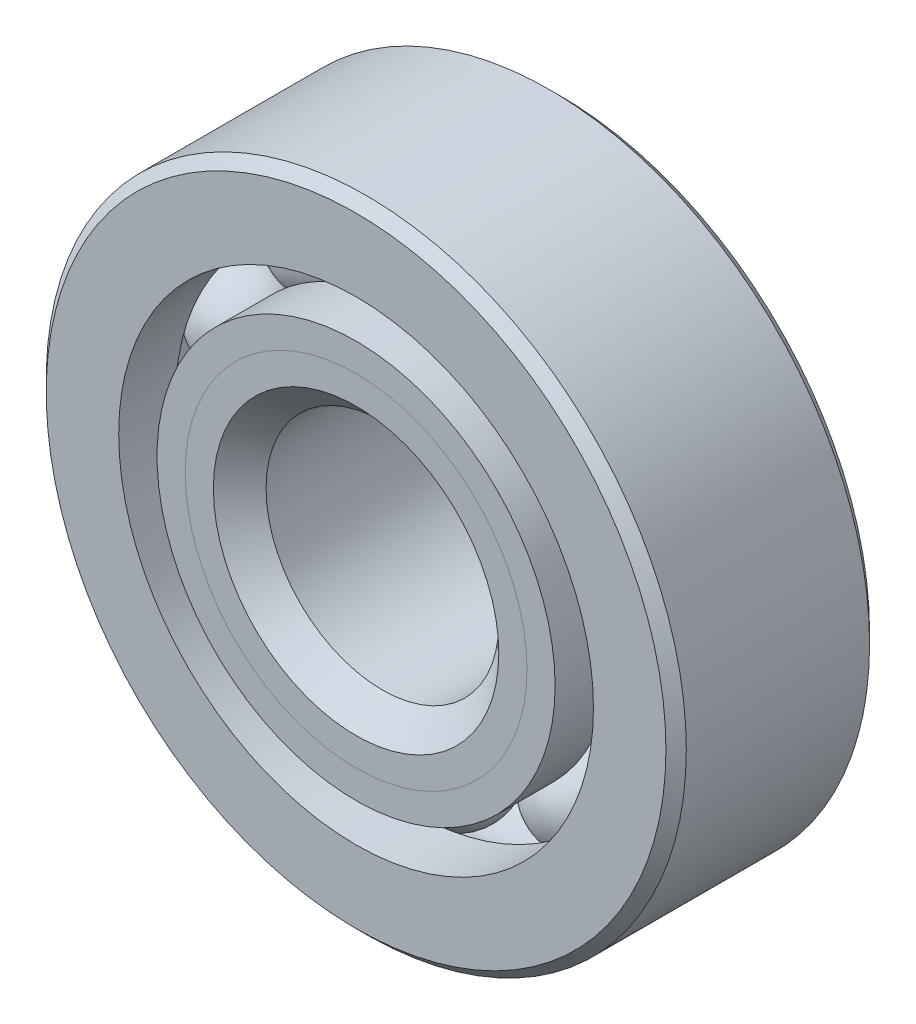
ISO-10303-21;
HEADER;
FILE_DESCRIPTION(('STEP AP214'),'2;1');
FILE_NAME('part.step','',(''),(''),'','','');
FILE_SCHEMA(('AUTOMOTIVE_DESIGN { 1 0 10303 214 1 1 1 1 }'));
ENDSEC;
DATA;
#1=APPLICATION_CONTEXT('core data for automotive mechanical design processes');
#2=APPLICATION_PROTOCOL_DEFINITION('international standard','automotive_design',2000,#1);
#3=PRODUCT_CONTEXT('',#1,'mechanical');
#4=PRODUCT('Part','Part','',(#3));
#5=PRODUCT_RELATED_PRODUCT_CATEGORY('part','',(#4));
#6=PRODUCT_DEFINITION_FORMATION('','',#4);
#7=PRODUCT_DEFINITION_CONTEXT('part definition',#1,'design');
#8=PRODUCT_DEFINITION('design','',#6,#7);
#9=PRODUCT_DEFINITION_SHAPE('','',#8);
#10=(LENGTH_UNIT() NAMED_UNIT(*) SI_UNIT(.MILLI.,.METRE.));
#11=(NAMED_UNIT(*) PLANE_ANGLE_UNIT() SI_UNIT($,.RADIAN.));
#12=(NAMED_UNIT(*) SI_UNIT($,.STERADIAN.) SOLID_ANGLE_UNIT());
#13=UNCERTAINTY_MEASURE_WITH_UNIT(LENGTH_MEASURE(1.E-05),#10,'distance_accuracy_value','');
#14=(GEOMETRIC_REPRESENTATION_CONTEXT(3) GLOBAL_UNCERTAINTY_ASSIGNED_CONTEXT((#13)) GLOBAL_UNIT_ASSIGNED_CONTEXT((#10,
#11,#12)) REPRESENTATION_CONTEXT('',''));
#15=CARTESIAN_POINT('',(0.,0.,0.));
#16=DIRECTION('',(0.,0.,1.));
#17=DIRECTION('',(1.,0.,0.));
#18=AXIS2_PLACEMENT_3D('',#15,#16,#17);
#19=CARTESIAN_POINT('',(-4.40838939219347,6.06762745781216,0.));
#20=DIRECTION('',(0.,0.,1.));
#21=DIRECTION('',(-0.587785252292462,0.809016994374955,0.));
#22=AXIS2_PLACEMENT_3D('',#19,#20,#21);
#23=SPHERICAL_SURFACE('',#22,1.68952158656808);
#24=CARTESIAN_POINT('',(-4.40838939219347,6.06762745781216,1.68952158656808));
#25=VERTEX_POINT('',#24);
#26=VERTEX_LOOP('',#25);
#27=FACE_BOUND('',#26,.T.);
#28=ADVANCED_FACE('F49',(#27),#23,.T.);
#29=CLOSED_SHELL('',(#28));
#30=MANIFOLD_SOLID_BREP('B2',#29);
#31=CARTESIAN_POINT('',(-7.13292387221363,2.31762745781219,0.));
#32=DIRECTION('',(0.,0.,1.));
#33=DIRECTION('',(-0.95105651629515,0.309016994374958,0.));
#34=AXIS2_PLACEMENT_3D('',#31,#32,#33);
#35=SPHERICAL_SURFACE('',#34,1.68952158656808);
#36=CARTESIAN_POINT('',(-7.13292387221363,2.31762745781219,1.68952158656808));
#37=VERTEX_POINT('',#36);
#38=VERTEX_LOOP('',#37);
#39=FACE_BOUND('',#38,.T.);
#40=ADVANCED_FACE('F84',(#39),#35,.T.);
#41=CLOSED_SHELL('',(#40));
#42=MANIFOLD_SOLID_BREP('B7',#41);
#43=CARTESIAN_POINT('',(-7.13292387221367,-2.31762745781204,0.));
#44=DIRECTION('',(0.,0.,1.));
#45=DIRECTION('',(-0.951056516295157,-0.309016994374938,0.));
#46=AXIS2_PLACEMENT_3D('',#43,#44,#45);
#47=SPHERICAL_SURFACE('',#46,1.68952158656808);
#48=CARTESIAN_POINT('',(-7.13292387221367,-2.31762745781204,1.68952158656808));
#49=VERTEX_POINT('',#48);
#50=VERTEX_LOOP('',#49);
#51=FACE_BOUND('',#50,.T.);
#52=ADVANCED_FACE('F119',(#51),#47,.T.);
#53=CLOSED_SHELL('',(#52));
#54=MANIFOLD_SOLID_BREP('B45',#53);
#55=CARTESIAN_POINT('',(-4.4083893921936,-6.06762745781207,0.));
#56=DIRECTION('',(0.,0.,1.));
#57=DIRECTION('',(-0.58778525229248,-0.809016994374942,0.));
#58=AXIS2_PLACEMENT_3D('',#55,#56,#57);
#59=SPHERICAL_SURFACE('',#58,1.68952158656808);
#60=CARTESIAN_POINT('',(-4.4083893921936,-6.06762745781207,1.68952158656808));
#61=VERTEX_POINT('',#60);
#62=VERTEX_LOOP('',#61);
#63=FACE_BOUND('',#62,.T.);
#64=ADVANCED_FACE('F151',(#63),#59,.T.);
#65=CLOSED_SHELL('',(#64));
#66=MANIFOLD_SOLID_BREP('B80',#65);
#67=CARTESIAN_POINT('',(0.,-7.5,0.));
#68=DIRECTION('',(0.,0.,1.));
#69=DIRECTION('',(0.,-1.,0.));
#70=AXIS2_PLACEMENT_3D('',#67,#68,#69);
#71=SPHERICAL_SURFACE('',#70,1.68952158656808);
#72=CARTESIAN_POINT('',(0.,-7.5,1.68952158656808));
#73=VERTEX_POINT('',#72);
#74=VERTEX_LOOP('',#73);
#75=FACE_BOUND('',#74,.T.);
#76=ADVANCED_FACE('F189',(#75),#71,.T.);
#77=CLOSED_SHELL('',(#76));
#78=MANIFOLD_SOLID_BREP('B115',#77);
#79=CARTESIAN_POINT('',(4.40838939219351,-6.06762745781213,0.));
#80=DIRECTION('',(0.,0.,1.));
#81=DIRECTION('',(0.587785252292469,-0.809016994374951,0.));
#82=AXIS2_PLACEMENT_3D('',#79,#80,#81);
#83=SPHERICAL_SURFACE('',#82,1.68952158656808);
#84=CARTESIAN_POINT('',(4.40838939219351,-6.06762745781213,1.68952158656808));
#85=VERTEX_POINT('',#84);
#86=VERTEX_LOOP('',#85);
#87=FACE_BOUND('',#86,.T.);
#88=ADVANCED_FACE('F224',(#87),#83,.T.);
#89=CLOSED_SHELL('',(#88));
#90=MANIFOLD_SOLID_BREP('B147',#89);
#91=CARTESIAN_POINT('',(7.13292387221364,-2.31762745781214,0.));
#92=DIRECTION('',(0.,0.,1.));
#93=DIRECTION('',(0.951056516295152,-0.309016994374952,0.));
#94=AXIS2_PLACEMENT_3D('',#91,#92,#93);
#95=SPHERICAL_SURFACE('',#94,1.68952158656808);
#96=CARTESIAN_POINT('',(7.13292387221364,-2.31762745781214,1.68952158656808));
#97=VERTEX_POINT('',#96);
#98=VERTEX_LOOP('',#97);
#99=FACE_BOUND('',#98,.T.);
#100=ADVANCED_FACE('F259',(#99),#95,.T.);
#101=CLOSED_SHELL('',(#100));
#102=MANIFOLD_SOLID_BREP('B185',#101);
#103=CARTESIAN_POINT('',(7.13292387221366,2.31762745781209,0.));
#104=DIRECTION('',(0.,0.,1.));
#105=DIRECTION('',(0.951056516295155,0.309016994374945,0.));
#106=AXIS2_PLACEMENT_3D('',#103,#104,#105);
#107=SPHERICAL_SURFACE('',#106,1.68952158656808);
#108=CARTESIAN_POINT('',(7.13292387221366,2.31762745781209,1.68952158656808));
#109=VERTEX_POINT('',#108);
#110=VERTEX_LOOP('',#109);
#111=FACE_BOUND('',#110,.T.);
#112=ADVANCED_FACE('F294',(#111),#107,.T.);
#113=CLOSED_SHELL('',(#112));
#114=MANIFOLD_SOLID_BREP('B220',#113);
#115=CARTESIAN_POINT('',(4.40838939219356,6.0676274578121,0.));
#116=DIRECTION('',(0.,0.,1.));
#117=DIRECTION('',(0.587785252292474,0.809016994374947,0.));
#118=AXIS2_PLACEMENT_3D('',#115,#116,#117);
#119=SPHERICAL_SURFACE('',#118,1.68952158656808);
#120=CARTESIAN_POINT('',(4.40838939219356,6.0676274578121,1.68952158656808));
#121=VERTEX_POINT('',#120);
#122=VERTEX_LOOP('',#121);
#123=FACE_BOUND('',#122,.T.);
#124=ADVANCED_FACE('F325',(#123),#119,.T.);
#125=CLOSED_SHELL('',(#124));
#126=MANIFOLD_SOLID_BREP('B255',#125);
#127=CARTESIAN_POINT('',(0.,7.5,0.));
#128=DIRECTION('',(0.,0.,1.));
#129=DIRECTION('',(0.,1.,0.));
#130=AXIS2_PLACEMENT_3D('',#127,#128,#129);
#131=SPHERICAL_SURFACE('',#130,1.68952158656808);
#132=CARTESIAN_POINT('',(0.,7.5,1.68952158656808));
#133=VERTEX_POINT('',#132);
#134=VERTEX_LOOP('',#133);
#135=FACE_BOUND('',#134,.T.);
#136=ADVANCED_FACE('F362',(#135),#131,.T.);
#137=CLOSED_SHELL('',(#136));
#138=MANIFOLD_SOLID_BREP('B290',#137);
#139=CARTESIAN_POINT('',(0.,5.87294927368765,3.5));
#140=DIRECTION('',(0.,0.,-1.));
#141=DIRECTION('',(-1.,0.,0.));
#142=AXIS2_PLACEMENT_3D('',#139,#140,#141);
#143=PLANE('',#142);
#144=CARTESIAN_POINT('',(0.,0.,3.5));
#145=DIRECTION('',(0.,0.,1.));
#146=DIRECTION('',(1.,0.,0.));
#147=AXIS2_PLACEMENT_3D('',#144,#145,#146);
#148=CIRCLE('',#147,4.90523920671596);
#149=CARTESIAN_POINT('',(4.90523920671596,0.,3.5));
#150=VERTEX_POINT('',#149);
#151=EDGE_CURVE('E425',#150,#150,#148,.T.);
#152=ORIENTED_EDGE('',*,*,#151,.F.);
#153=EDGE_LOOP('',(#152));
#154=FACE_BOUND('',#153,.T.);
#155=CARTESIAN_POINT('',(0.,0.,3.5));
#156=DIRECTION('',(0.,0.,1.));
#157=DIRECTION('',(1.,0.,0.));
#158=AXIS2_PLACEMENT_3D('',#155,#156,#157);
#159=CIRCLE('',#158,5.87294927368765);
#160=CARTESIAN_POINT('',(5.87294927368765,0.,3.5));
#161=VERTEX_POINT('',#160);
#162=EDGE_CURVE('E361',#161,#161,#159,.T.);
#163=ORIENTED_EDGE('',*,*,#162,.T.);
#164=EDGE_LOOP('',(#163));
#165=FACE_BOUND('',#164,.T.);
#166=ADVANCED_FACE('F391',(#154,#165),#143,.F.);
#167=CARTESIAN_POINT('',(0.,0.,2.53228993302831));
#168=DIRECTION('',(0.,0.,1.));
#169=DIRECTION('',(1.,0.,0.));
#170=AXIS2_PLACEMENT_3D('',#167,#168,#169);
#171=CONICAL_SURFACE('',#170,4.90523920671596,0.78539816339745);
#172=ORIENTED_EDGE('',*,*,#162,.F.);
#173=EDGE_LOOP('',(#172));
#174=FACE_BOUND('',#173,.T.);
#175=CARTESIAN_POINT('',(0.,0.,2.53228993302831));
#176=DIRECTION('',(0.,0.,1.));
#177=DIRECTION('',(1.,0.,0.));
#178=AXIS2_PLACEMENT_3D('',#175,#176,#177);
#179=CIRCLE('',#178,4.90523920671596);
#180=CARTESIAN_POINT('',(4.90523920671596,0.,2.53228993302831));
#181=VERTEX_POINT('',#180);
#182=EDGE_CURVE('E397',#181,#181,#179,.T.);
#183=ORIENTED_EDGE('',*,*,#182,.T.);
#184=EDGE_LOOP('',(#183));
#185=FACE_BOUND('',#184,.T.);
#186=ADVANCED_FACE('F432',(#174,#185),#171,.T.);
#187=CARTESIAN_POINT('',(0.,0.,3.5));
#188=DIRECTION('',(0.,0.,1.));
#189=DIRECTION('',(1.,0.,0.));
#190=AXIS2_PLACEMENT_3D('',#187,#188,#189);
#191=CYLINDRICAL_SURFACE('',#190,4.90523920671596);
#192=ORIENTED_EDGE('',*,*,#182,.F.);
#193=EDGE_LOOP('',(#192));
#194=FACE_BOUND('',#193,.T.);
#195=CARTESIAN_POINT('',(0.,0.,0.));
#196=DIRECTION('',(0.,0.,1.));
#197=DIRECTION('',(1.,0.,0.));
#198=AXIS2_PLACEMENT_3D('',#195,#196,#197);
#199=CIRCLE('',#198,4.90523920671596);
#200=CARTESIAN_POINT('',(4.90523920671596,0.,0.));
#201=VERTEX_POINT('',#200);
#202=EDGE_CURVE('E401',#201,#201,#199,.T.);
#203=ORIENTED_EDGE('',*,*,#202,.T.);
#204=EDGE_LOOP('',(#203));
#205=FACE_BOUND('',#204,.T.);
#206=ADVANCED_FACE('F436',(#194,#205),#191,.T.);
#207=CARTESIAN_POINT('',(0.,4.90523920671596,0.));
#208=DIRECTION('',(0.,0.,-1.));
#209=DIRECTION('',(-1.,0.,0.));
#210=AXIS2_PLACEMENT_3D('',#207,#208,#209);
#211=PLANE('',#210);
#212=ORIENTED_EDGE('',*,*,#202,.F.);
#213=EDGE_LOOP('',(#212));
#214=FACE_BOUND('',#213,.T.);
#215=CARTESIAN_POINT('',(0.,0.,0.));
#216=DIRECTION('',(0.,0.,1.));
#217=DIRECTION('',(1.,0.,0.));
#218=AXIS2_PLACEMENT_3D('',#215,#216,#217);
#219=CIRCLE('',#218,5.81047841343192);
#220=CARTESIAN_POINT('',(5.81047841343192,0.,0.));
#221=VERTEX_POINT('',#220);
#222=EDGE_CURVE('E405',#221,#221,#219,.T.);
#223=ORIENTED_EDGE('',*,*,#222,.T.);
#224=EDGE_LOOP('',(#223));
#225=FACE_BOUND('',#224,.T.);
#226=ADVANCED_FACE('F441',(#214,#225),#211,.F.);
#227=CARTESIAN_POINT('',(0.,0.,0.));
#228=DIRECTION('',(0.,0.,1.));
#229=DIRECTION('',(1.,0.,0.));
#230=AXIS2_PLACEMENT_3D('',#227,#228,#229);
#231=TOROIDAL_SURFACE('',#230,7.5,1.68952158656808);
#232=ORIENTED_EDGE('',*,*,#222,.F.);
#233=EDGE_LOOP('',(#232));
#234=FACE_BOUND('',#233,.T.);
#235=CARTESIAN_POINT('',(0.,0.,-1.55555555555556));
#236=DIRECTION('',(0.,0.,1.));
#237=DIRECTION('',(1.,0.,0.));
#238=AXIS2_PLACEMENT_3D('',#235,#236,#237);
#239=CIRCLE('',#238,6.84065934065934);
#240=CARTESIAN_POINT('',(6.84065934065934,0.,-1.55555555555556));
#241=VERTEX_POINT('',#240);
#242=EDGE_CURVE('E410',#241,#241,#239,.T.);
#243=ORIENTED_EDGE('',*,*,#242,.T.);
#244=EDGE_LOOP('',(#243));
#245=FACE_BOUND('',#244,.T.);
#246=ADVANCED_FACE('F447',(#234,#245),#231,.F.);
#247=CARTESIAN_POINT('',(0.,0.,3.5));
#248=DIRECTION('',(0.,0.,1.));
#249=DIRECTION('',(1.,0.,0.));
#250=AXIS2_PLACEMENT_3D('',#247,#248,#249);
#251=CYLINDRICAL_SURFACE('',#250,6.84065934065934);
#252=ORIENTED_EDGE('',*,*,#242,.F.);
#253=EDGE_LOOP('',(#252));
#254=FACE_BOUND('',#253,.T.);
#255=CARTESIAN_POINT('',(0.,0.,-3.5));
#256=DIRECTION('',(0.,0.,1.));
#257=DIRECTION('',(1.,0.,0.));
#258=AXIS2_PLACEMENT_3D('',#255,#256,#257);
#259=CIRCLE('',#258,6.84065934065934);
#260=CARTESIAN_POINT('',(6.84065934065934,0.,-3.5));
#261=VERTEX_POINT('',#260);
#262=EDGE_CURVE('E413',#261,#261,#259,.T.);
#263=ORIENTED_EDGE('',*,*,#262,.T.);
#264=EDGE_LOOP('',(#263));
#265=FACE_BOUND('',#264,.T.);
#266=ADVANCED_FACE('F451',(#254,#265),#251,.T.);
#267=CARTESIAN_POINT('',(0.,4.35,-3.5));
#268=DIRECTION('',(0.,0.,1.));
#269=DIRECTION('',(1.,0.,0.));
#270=AXIS2_PLACEMENT_3D('',#267,#268,#269);
#271=PLANE('',#270);
#272=ORIENTED_EDGE('',*,*,#262,.F.);
#273=EDGE_LOOP('',(#272));
#274=FACE_BOUND('',#273,.T.);
#275=CARTESIAN_POINT('',(0.,0.,-3.5));
#276=DIRECTION('',(0.,0.,1.));
#277=DIRECTION('',(1.,0.,0.));
#278=AXIS2_PLACEMENT_3D('',#275,#276,#277);
#279=CIRCLE('',#278,4.35);
#280=CARTESIAN_POINT('',(4.35,0.,-3.5));
#281=VERTEX_POINT('',#280);
#282=EDGE_CURVE('E416',#281,#281,#279,.T.);
#283=ORIENTED_EDGE('',*,*,#282,.T.);
#284=EDGE_LOOP('',(#283));
#285=FACE_BOUND('',#284,.T.);
#286=ADVANCED_FACE('F455',(#274,#285),#271,.F.);
#287=CARTESIAN_POINT('',(0.,0.,-3.15));
#288=DIRECTION('',(0.,0.,-1.));
#289=DIRECTION('',(-1.,0.,0.));
#290=AXIS2_PLACEMENT_3D('',#287,#288,#289);
#291=CONICAL_SURFACE('',#290,4.,0.785398163397448);
#292=ORIENTED_EDGE('',*,*,#282,.F.);
#293=EDGE_LOOP('',(#292));
#294=FACE_BOUND('',#293,.T.);
#295=CARTESIAN_POINT('',(0.,0.,-3.15));
#296=DIRECTION('',(0.,0.,1.));
#297=DIRECTION('',(1.,0.,0.));
#298=AXIS2_PLACEMENT_3D('',#295,#296,#297);
#299=CIRCLE('',#298,4.);
#300=CARTESIAN_POINT('',(4.,0.,-3.15));
#301=VERTEX_POINT('',#300);
#302=EDGE_CURVE('E419',#301,#301,#299,.T.);
#303=ORIENTED_EDGE('',*,*,#302,.T.);
#304=EDGE_LOOP('',(#303));
#305=FACE_BOUND('',#304,.T.);
#306=ADVANCED_FACE('F459',(#294,#305),#291,.F.);
#307=CARTESIAN_POINT('',(0.,0.,3.5));
#308=DIRECTION('',(0.,0.,1.));
#309=DIRECTION('',(1.,0.,0.));
#310=AXIS2_PLACEMENT_3D('',#307,#308,#309);
#311=CYLINDRICAL_SURFACE('',#310,4.);
#312=ORIENTED_EDGE('',*,*,#302,.F.);
#313=EDGE_LOOP('',(#312));
#314=FACE_BOUND('',#313,.T.);
#315=CARTESIAN_POINT('',(0.,0.,2.59476079328405));
#316=DIRECTION('',(0.,0.,1.));
#317=DIRECTION('',(1.,0.,0.));
#318=AXIS2_PLACEMENT_3D('',#315,#316,#317);
#319=CIRCLE('',#318,4.);
#320=CARTESIAN_POINT('',(4.,0.,2.59476079328405));
#321=VERTEX_POINT('',#320);
#322=EDGE_CURVE('E422',#321,#321,#319,.T.);
#323=ORIENTED_EDGE('',*,*,#322,.T.);
#324=EDGE_LOOP('',(#323));
#325=FACE_BOUND('',#324,.T.);
#326=ADVANCED_FACE('F463',(#314,#325),#311,.F.);
#327=CARTESIAN_POINT('',(0.,0.,3.5));
#328=DIRECTION('',(0.,0.,1.));
#329=DIRECTION('',(1.,0.,0.));
#330=AXIS2_PLACEMENT_3D('',#327,#328,#329);
#331=CONICAL_SURFACE('',#330,4.90523920671596,0.78539816339745);
#332=ORIENTED_EDGE('',*,*,#322,.F.);
#333=EDGE_LOOP('',(#332));
#334=FACE_BOUND('',#333,.T.);
#335=ORIENTED_EDGE('',*,*,#151,.T.);
#336=EDGE_LOOP('',(#335));
#337=FACE_BOUND('',#336,.T.);
#338=ADVANCED_FACE('F429',(#334,#337),#331,.F.);
#339=CLOSED_SHELL('',(#166,#186,#206,#226,#246,#266,#286,#306,#326,#338));
#340=MANIFOLD_SOLID_BREP('B321',#339);
#341=CARTESIAN_POINT('',(0.,6.84065934065934,3.5));
#342=DIRECTION('',(0.,0.,-1.));
#343=DIRECTION('',(-1.,0.,0.));
#344=AXIS2_PLACEMENT_3D('',#341,#342,#343);
#345=PLANE('',#344);
#346=CARTESIAN_POINT('',(0.,0.,3.5));
#347=DIRECTION('',(0.,0.,1.));
#348=DIRECTION('',(1.,0.,0.));
#349=AXIS2_PLACEMENT_3D('',#346,#347,#348);
#350=CIRCLE('',#349,5.87294927368765);
#351=CARTESIAN_POINT('',(5.87294927368765,0.,3.5));
#352=VERTEX_POINT('',#351);
#353=EDGE_CURVE('E390',#352,#352,#350,.T.);
#354=ORIENTED_EDGE('',*,*,#353,.F.);
#355=EDGE_LOOP('',(#354));
#356=FACE_BOUND('',#355,.T.);
#357=CARTESIAN_POINT('',(0.,0.,3.5));
#358=DIRECTION('',(0.,0.,1.));
#359=DIRECTION('',(1.,0.,0.));
#360=AXIS2_PLACEMENT_3D('',#357,#358,#359);
#361=CIRCLE('',#360,6.84065934065934);
#362=CARTESIAN_POINT('',(6.84065934065934,0.,3.5));
#363=VERTEX_POINT('',#362);
#364=EDGE_CURVE('E580',#363,#363,#361,.T.);
#365=ORIENTED_EDGE('',*,*,#364,.T.);
#366=EDGE_LOOP('',(#365));
#367=FACE_BOUND('',#366,.T.);
#368=ADVANCED_FACE('F558',(#356,#367),#345,.F.);
#369=CARTESIAN_POINT('',(0.,0.,3.5));
#370=DIRECTION('',(0.,0.,1.));
#371=DIRECTION('',(1.,0.,0.));
#372=AXIS2_PLACEMENT_3D('',#369,#370,#371);
#373=CONICAL_SURFACE('',#372,5.87294927368765,0.78539816339745);
#374=CARTESIAN_POINT('',(0.,0.,2.53228993302831));
#375=DIRECTION('',(0.,0.,1.));
#376=DIRECTION('',(1.,0.,0.));
#377=AXIS2_PLACEMENT_3D('',#374,#375,#376);
#378=CIRCLE('',#377,4.90523920671596);
#379=CARTESIAN_POINT('',(4.90523920671596,0.,2.53228993302831));
#380=VERTEX_POINT('',#379);
#381=EDGE_CURVE('E564',#380,#380,#378,.T.);
#382=ORIENTED_EDGE('',*,*,#381,.F.);
#383=EDGE_LOOP('',(#382));
#384=FACE_BOUND('',#383,.T.);
#385=ORIENTED_EDGE('',*,*,#353,.T.);
#386=EDGE_LOOP('',(#385));
#387=FACE_BOUND('',#386,.T.);
#388=ADVANCED_FACE('F605',(#384,#387),#373,.F.);
#389=CARTESIAN_POINT('',(0.,0.,3.5));
#390=DIRECTION('',(0.,0.,1.));
#391=DIRECTION('',(1.,0.,0.));
#392=AXIS2_PLACEMENT_3D('',#389,#390,#391);
#393=CYLINDRICAL_SURFACE('',#392,4.90523920671596);
#394=CARTESIAN_POINT('',(0.,0.,0.));
#395=DIRECTION('',(0.,0.,1.));
#396=DIRECTION('',(1.,0.,0.));
#397=AXIS2_PLACEMENT_3D('',#394,#395,#396);
#398=CIRCLE('',#397,4.90523920671596);
#399=CARTESIAN_POINT('',(4.90523920671596,0.,0.));
#400=VERTEX_POINT('',#399);
#401=EDGE_CURVE('E568',#400,#400,#398,.T.);
#402=ORIENTED_EDGE('',*,*,#401,.F.);
#403=EDGE_LOOP('',(#402));
#404=FACE_BOUND('',#403,.T.);
#405=ORIENTED_EDGE('',*,*,#381,.T.);
#406=EDGE_LOOP('',(#405));
#407=FACE_BOUND('',#406,.T.);
#408=ADVANCED_FACE('F600',(#404,#407),#393,.F.);
#409=CARTESIAN_POINT('',(0.,4.90523920671596,0.));
#410=DIRECTION('',(0.,0.,1.));
#411=DIRECTION('',(1.,0.,0.));
#412=AXIS2_PLACEMENT_3D('',#409,#410,#411);
#413=PLANE('',#412);
#414=CARTESIAN_POINT('',(0.,0.,0.));
#415=DIRECTION('',(0.,0.,1.));
#416=DIRECTION('',(1.,0.,0.));
#417=AXIS2_PLACEMENT_3D('',#414,#415,#416);
#418=CIRCLE('',#417,5.81047841343192);
#419=CARTESIAN_POINT('',(5.81047841343192,0.,0.));
#420=VERTEX_POINT('',#419);
#421=EDGE_CURVE('E572',#420,#420,#418,.T.);
#422=ORIENTED_EDGE('',*,*,#421,.F.);
#423=EDGE_LOOP('',(#422));
#424=FACE_BOUND('',#423,.T.);
#425=ORIENTED_EDGE('',*,*,#401,.T.);
#426=EDGE_LOOP('',(#425));
#427=FACE_BOUND('',#426,.T.);
#428=ADVANCED_FACE('F594',(#424,#427),#413,.F.);
#429=CARTESIAN_POINT('',(0.,0.,0.));
#430=DIRECTION('',(0.,0.,1.));
#431=DIRECTION('',(1.,0.,0.));
#432=AXIS2_PLACEMENT_3D('',#429,#430,#431);
#433=TOROIDAL_SURFACE('',#432,7.5,1.68952158656808);
#434=CARTESIAN_POINT('',(0.,0.,1.55555555555555));
#435=DIRECTION('',(0.,0.,1.));
#436=DIRECTION('',(1.,0.,0.));
#437=AXIS2_PLACEMENT_3D('',#434,#435,#436);
#438=CIRCLE('',#437,6.84065934065934);
#439=CARTESIAN_POINT('',(6.84065934065934,0.,1.55555555555555));
#440=VERTEX_POINT('',#439);
#441=EDGE_CURVE('E577',#440,#440,#438,.T.);
#442=ORIENTED_EDGE('',*,*,#441,.F.);
#443=EDGE_LOOP('',(#442));
#444=FACE_BOUND('',#443,.T.);
#445=ORIENTED_EDGE('',*,*,#421,.T.);
#446=EDGE_LOOP('',(#445));
#447=FACE_BOUND('',#446,.T.);
#448=ADVANCED_FACE('F588',(#444,#447),#433,.F.);
#449=CARTESIAN_POINT('',(0.,0.,3.5));
#450=DIRECTION('',(0.,0.,1.));
#451=DIRECTION('',(1.,0.,0.));
#452=AXIS2_PLACEMENT_3D('',#449,#450,#451);
#453=CYLINDRICAL_SURFACE('',#452,6.84065934065934);
#454=ORIENTED_EDGE('',*,*,#364,.F.);
#455=EDGE_LOOP('',(#454));
#456=FACE_BOUND('',#455,.T.);
#457=ORIENTED_EDGE('',*,*,#441,.T.);
#458=EDGE_LOOP('',(#457));
#459=FACE_BOUND('',#458,.T.);
#460=ADVANCED_FACE('F585',(#456,#459),#453,.T.);
#461=CLOSED_SHELL('',(#368,#388,#408,#428,#448,#460));
#462=MANIFOLD_SOLID_BREP('B356',#461);
#463=CARTESIAN_POINT('',(0.,0.,3.15));
#464=DIRECTION('',(0.,0.,-1.));
#465=DIRECTION('',(-1.,0.,0.));
#466=AXIS2_PLACEMENT_3D('',#463,#464,#465);
#467=CONICAL_SURFACE('',#466,11.,0.785398163397448);
#468=CARTESIAN_POINT('',(0.,0.,3.5));
#469=DIRECTION('',(0.,0.,1.));
#470=DIRECTION('',(1.,0.,0.));
#471=AXIS2_PLACEMENT_3D('',#468,#469,#470);
#472=CIRCLE('',#471,10.65);
#473=CARTESIAN_POINT('',(10.65,0.,3.5));
#474=VERTEX_POINT('',#473);
#475=EDGE_CURVE('E684',#474,#474,#472,.T.);
#476=ORIENTED_EDGE('',*,*,#475,.F.);
#477=EDGE_LOOP('',(#476));
#478=FACE_BOUND('',#477,.T.);
#479=CARTESIAN_POINT('',(0.,0.,3.15));
#480=DIRECTION('',(0.,0.,1.));
#481=DIRECTION('',(1.,0.,0.));
#482=AXIS2_PLACEMENT_3D('',#479,#480,#481);
#483=CIRCLE('',#482,11.);
#484=CARTESIAN_POINT('',(11.,0.,3.15));
#485=VERTEX_POINT('',#484);
#486=EDGE_CURVE('E557',#485,#485,#483,.T.);
#487=ORIENTED_EDGE('',*,*,#486,.T.);
#488=EDGE_LOOP('',(#487));
#489=FACE_BOUND('',#488,.T.);
#490=ADVANCED_FACE('F656',(#478,#489),#467,.T.);
#491=CARTESIAN_POINT('',(0.,0.,3.5));
#492=DIRECTION('',(0.,0.,1.));
#493=DIRECTION('',(1.,0.,0.));
#494=AXIS2_PLACEMENT_3D('',#491,#492,#493);
#495=CYLINDRICAL_SURFACE('',#494,11.);
#496=ORIENTED_EDGE('',*,*,#486,.F.);
#497=EDGE_LOOP('',(#496));
#498=FACE_BOUND('',#497,.T.);
#499=CARTESIAN_POINT('',(0.,0.,-3.15));
#500=DIRECTION('',(0.,0.,1.));
#501=DIRECTION('',(1.,0.,0.));
#502=AXIS2_PLACEMENT_3D('',#499,#500,#501);
#503=CIRCLE('',#502,11.);
#504=CARTESIAN_POINT('',(11.,0.,-3.15));
#505=VERTEX_POINT('',#504);
#506=EDGE_CURVE('E662',#505,#505,#503,.T.);
#507=ORIENTED_EDGE('',*,*,#506,.T.);
#508=EDGE_LOOP('',(#507));
#509=FACE_BOUND('',#508,.T.);
#510=ADVANCED_FACE('F691',(#498,#509),#495,.T.);
#511=CARTESIAN_POINT('',(0.,0.,-3.5));
#512=DIRECTION('',(0.,0.,1.));
#513=DIRECTION('',(1.,0.,0.));
#514=AXIS2_PLACEMENT_3D('',#511,#512,#513);
#515=CONICAL_SURFACE('',#514,10.65,0.785398163397447);
#516=ORIENTED_EDGE('',*,*,#506,.F.);
#517=EDGE_LOOP('',(#516));
#518=FACE_BOUND('',#517,.T.);
#519=CARTESIAN_POINT('',(0.,0.,-3.5));
#520=DIRECTION('',(0.,0.,1.));
#521=DIRECTION('',(1.,0.,0.));
#522=AXIS2_PLACEMENT_3D('',#519,#520,#521);
#523=CIRCLE('',#522,10.65);
#524=CARTESIAN_POINT('',(10.65,0.,-3.5));
#525=VERTEX_POINT('',#524);
#526=EDGE_CURVE('E666',#525,#525,#523,.T.);
#527=ORIENTED_EDGE('',*,*,#526,.T.);
#528=EDGE_LOOP('',(#527));
#529=FACE_BOUND('',#528,.T.);
#530=ADVANCED_FACE('F695',(#518,#529),#515,.T.);
#531=CARTESIAN_POINT('',(0.,10.65,-3.5));
#532=DIRECTION('',(0.,0.,1.));
#533=DIRECTION('',(1.,0.,0.));
#534=AXIS2_PLACEMENT_3D('',#531,#532,#533);
#535=PLANE('',#534);
#536=ORIENTED_EDGE('',*,*,#526,.F.);
#537=EDGE_LOOP('',(#536));
#538=FACE_BOUND('',#537,.T.);
#539=CARTESIAN_POINT('',(0.,0.,-3.5));
#540=DIRECTION('',(0.,0.,1.));
#541=DIRECTION('',(1.,0.,0.));
#542=AXIS2_PLACEMENT_3D('',#539,#540,#541);
#543=CIRCLE('',#542,8.15934065934066);
#544=CARTESIAN_POINT('',(8.15934065934066,0.,-3.5));
#545=VERTEX_POINT('',#544);
#546=EDGE_CURVE('E670',#545,#545,#543,.T.);
#547=ORIENTED_EDGE('',*,*,#546,.T.);
#548=EDGE_LOOP('',(#547));
#549=FACE_BOUND('',#548,.T.);
#550=ADVANCED_FACE('F700',(#538,#549),#535,.F.);
#551=CARTESIAN_POINT('',(0.,0.,3.5));
#552=DIRECTION('',(0.,0.,1.));
#553=DIRECTION('',(1.,0.,0.));
#554=AXIS2_PLACEMENT_3D('',#551,#552,#553);
#555=CYLINDRICAL_SURFACE('',#554,8.15934065934066);
#556=ORIENTED_EDGE('',*,*,#546,.F.);
#557=EDGE_LOOP('',(#556));
#558=FACE_BOUND('',#557,.T.);
#559=CARTESIAN_POINT('',(0.,0.,-1.55555555555556));
#560=DIRECTION('',(0.,0.,1.));
#561=DIRECTION('',(1.,0.,0.));
#562=AXIS2_PLACEMENT_3D('',#559,#560,#561);
#563=CIRCLE('',#562,8.15934065934066);
#564=CARTESIAN_POINT('',(8.15934065934066,0.,-1.55555555555556));
#565=VERTEX_POINT('',#564);
#566=EDGE_CURVE('E675',#565,#565,#563,.T.);
#567=ORIENTED_EDGE('',*,*,#566,.T.);
#568=EDGE_LOOP('',(#567));
#569=FACE_BOUND('',#568,.T.);
#570=ADVANCED_FACE('F706',(#558,#569),#555,.F.);
#571=CARTESIAN_POINT('',(0.,0.,0.));
#572=DIRECTION('',(0.,0.,1.));
#573=DIRECTION('',(1.,0.,0.));
#574=AXIS2_PLACEMENT_3D('',#571,#572,#573);
#575=TOROIDAL_SURFACE('',#574,7.5,1.68952158656808);
#576=ORIENTED_EDGE('',*,*,#566,.F.);
#577=EDGE_LOOP('',(#576));
#578=FACE_BOUND('',#577,.T.);
#579=CARTESIAN_POINT('',(0.,0.,1.55555555555555));
#580=DIRECTION('',(0.,0.,1.));
#581=DIRECTION('',(1.,0.,0.));
#582=AXIS2_PLACEMENT_3D('',#579,#580,#581);
#583=CIRCLE('',#582,8.15934065934066);
#584=CARTESIAN_POINT('',(8.15934065934066,0.,1.55555555555555));
#585=VERTEX_POINT('',#584);
#586=EDGE_CURVE('E678',#585,#585,#583,.T.);
#587=ORIENTED_EDGE('',*,*,#586,.T.);
#588=EDGE_LOOP('',(#587));
#589=FACE_BOUND('',#588,.T.);
#590=ADVANCED_FACE('F710',(#578,#589),#575,.F.);
#591=CARTESIAN_POINT('',(0.,0.,3.5));
#592=DIRECTION('',(0.,0.,1.));
#593=DIRECTION('',(1.,0.,0.));
#594=AXIS2_PLACEMENT_3D('',#591,#592,#593);
#595=CYLINDRICAL_SURFACE('',#594,8.15934065934066);
#596=ORIENTED_EDGE('',*,*,#586,.F.);
#597=EDGE_LOOP('',(#596));
#598=FACE_BOUND('',#597,.T.);
#599=CARTESIAN_POINT('',(0.,0.,3.5));
#600=DIRECTION('',(0.,0.,1.));
#601=DIRECTION('',(1.,0.,0.));
#602=AXIS2_PLACEMENT_3D('',#599,#600,#601);
#603=CIRCLE('',#602,8.15934065934066);
#604=CARTESIAN_POINT('',(8.15934065934066,0.,3.5));
#605=VERTEX_POINT('',#604);
#606=EDGE_CURVE('E681',#605,#605,#603,.T.);
#607=ORIENTED_EDGE('',*,*,#606,.T.);
#608=EDGE_LOOP('',(#607));
#609=FACE_BOUND('',#608,.T.);
#610=ADVANCED_FACE('F714',(#598,#609),#595,.F.);
#611=CARTESIAN_POINT('',(0.,10.65,3.5));
#612=DIRECTION('',(0.,0.,-1.));
#613=DIRECTION('',(-1.,0.,0.));
#614=AXIS2_PLACEMENT_3D('',#611,#612,#613);
#615=PLANE('',#614);
#616=ORIENTED_EDGE('',*,*,#606,.F.);
#617=EDGE_LOOP('',(#616));
#618=FACE_BOUND('',#617,.T.);
#619=ORIENTED_EDGE('',*,*,#475,.T.);
#620=EDGE_LOOP('',(#619));
#621=FACE_BOUND('',#620,.T.);
#622=ADVANCED_FACE('F688',(#618,#621),#615,.F.);
#623=CLOSED_SHELL('',(#490,#510,#530,#550,#570,#590,#610,#622));
#624=MANIFOLD_SOLID_BREP('B385',#623);
#625=ADVANCED_BREP_SHAPE_REPRESENTATION('',(#18,#30,#42,#54,#66,#78,#90,#102,#114,#126,#138,
#340,#462,#624),#14);
#626=SHAPE_DEFINITION_REPRESENTATION(#9,#625);
ENDSEC;
END-ISO-10303-21;
